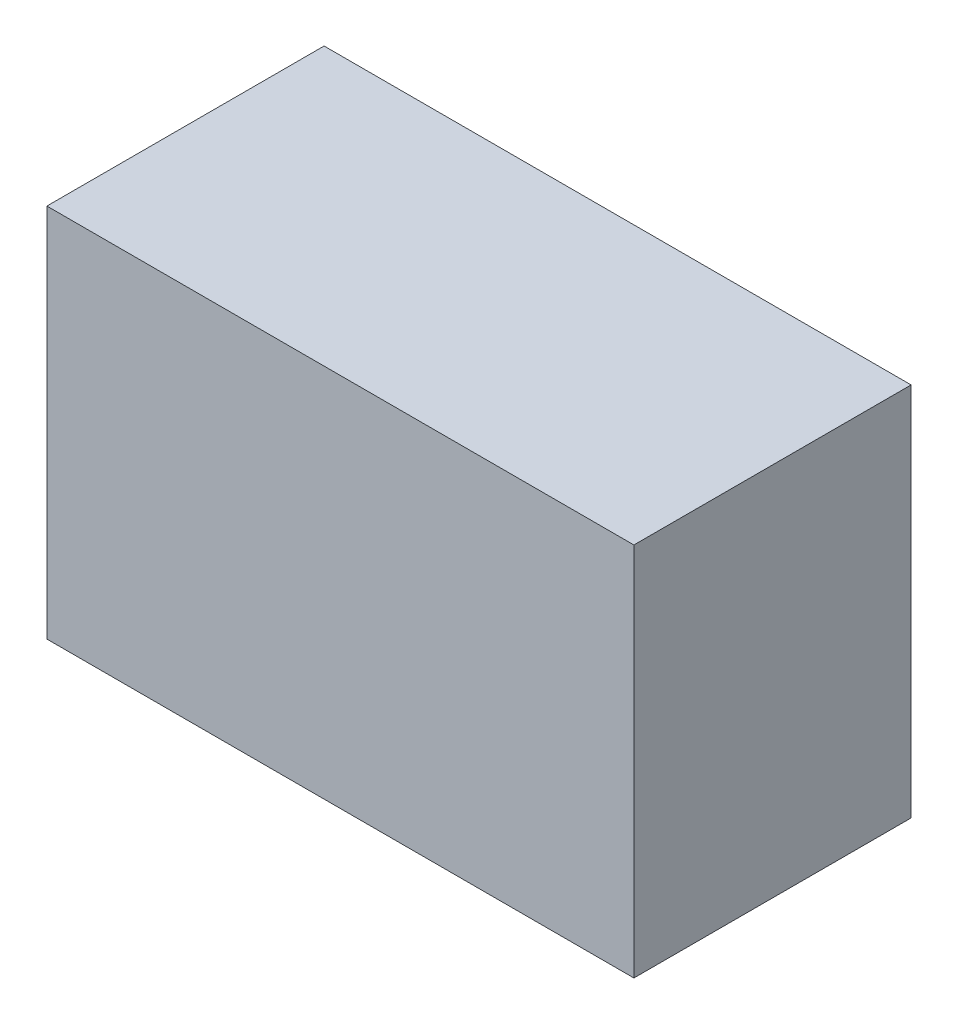
ISO-10303-21;
HEADER;
FILE_DESCRIPTION(('STEP AP214'),'2;1');
FILE_NAME('part.step','',(''),(''),'','','');
FILE_SCHEMA(('AUTOMOTIVE_DESIGN { 1 0 10303 214 1 1 1 1 }'));
ENDSEC;
DATA;
#1=APPLICATION_CONTEXT('core data for automotive mechanical design processes');
#2=APPLICATION_PROTOCOL_DEFINITION('international standard','automotive_design',2000,#1);
#3=PRODUCT_CONTEXT('',#1,'mechanical');
#4=PRODUCT('Part','Part','',(#3));
#5=PRODUCT_RELATED_PRODUCT_CATEGORY('part','',(#4));
#6=PRODUCT_DEFINITION_FORMATION('','',#4);
#7=PRODUCT_DEFINITION_CONTEXT('part definition',#1,'design');
#8=PRODUCT_DEFINITION('design','',#6,#7);
#9=PRODUCT_DEFINITION_SHAPE('','',#8);
#10=(LENGTH_UNIT() NAMED_UNIT(*) SI_UNIT(.MILLI.,.METRE.));
#11=(NAMED_UNIT(*) PLANE_ANGLE_UNIT() SI_UNIT($,.RADIAN.));
#12=(NAMED_UNIT(*) SI_UNIT($,.STERADIAN.) SOLID_ANGLE_UNIT());
#13=UNCERTAINTY_MEASURE_WITH_UNIT(LENGTH_MEASURE(1.E-05),#10,'distance_accuracy_value','');
#14=(GEOMETRIC_REPRESENTATION_CONTEXT(3) GLOBAL_UNCERTAINTY_ASSIGNED_CONTEXT((#13)) GLOBAL_UNIT_ASSIGNED_CONTEXT((#10,
#11,#12)) REPRESENTATION_CONTEXT('',''));
#15=CARTESIAN_POINT('',(0.,0.,0.));
#16=DIRECTION('',(0.,0.,1.));
#17=DIRECTION('',(1.,0.,0.));
#18=AXIS2_PLACEMENT_3D('',#15,#16,#17);
#19=CARTESIAN_POINT('',(36.,46.,17.));
#20=DIRECTION('',(-1.,0.,0.));
#21=DIRECTION('',(0.,0.,1.));
#22=AXIS2_PLACEMENT_3D('',#19,#20,#21);
#23=PLANE('',#22);
#24=DIRECTION('',(0.,0.,-1.));
#25=VECTOR('',#24,1.);
#26=CARTESIAN_POINT('',(36.,0.,17.));
#27=LINE('',#26,#25);
#28=CARTESIAN_POINT('',(36.,0.,17.));
#29=VERTEX_POINT('',#28);
#30=CARTESIAN_POINT('',(36.,0.,-17.));
#31=VERTEX_POINT('',#30);
#32=EDGE_CURVE('E102',#29,#31,#27,.T.);
#33=ORIENTED_EDGE('',*,*,#32,.T.);
#34=DIRECTION('',(0.,-1.,0.));
#35=VECTOR('',#34,1.);
#36=CARTESIAN_POINT('',(36.,46.,-17.));
#37=LINE('',#36,#35);
#38=CARTESIAN_POINT('',(36.,46.,-17.));
#39=VERTEX_POINT('',#38);
#40=EDGE_CURVE('E11',#39,#31,#37,.T.);
#41=ORIENTED_EDGE('',*,*,#40,.F.);
#42=DIRECTION('',(0.,0.,-1.));
#43=VECTOR('',#42,1.);
#44=CARTESIAN_POINT('',(36.,46.,17.));
#45=LINE('',#44,#43);
#46=CARTESIAN_POINT('',(36.,46.,17.));
#47=VERTEX_POINT('',#46);
#48=EDGE_CURVE('E95',#47,#39,#45,.T.);
#49=ORIENTED_EDGE('',*,*,#48,.F.);
#50=DIRECTION('',(0.,-1.,0.));
#51=VECTOR('',#50,1.);
#52=CARTESIAN_POINT('',(36.,46.,17.));
#53=LINE('',#52,#51);
#54=EDGE_CURVE('E99',#47,#29,#53,.T.);
#55=ORIENTED_EDGE('',*,*,#54,.T.);
#56=EDGE_LOOP('',(#33,#41,#49,#55));
#57=FACE_BOUND('',#56,.T.);
#58=ADVANCED_FACE('F41',(#57),#23,.F.);
#59=CARTESIAN_POINT('',(-36.,46.,-17.));
#60=DIRECTION('',(0.,0.,1.));
#61=DIRECTION('',(1.,0.,0.));
#62=AXIS2_PLACEMENT_3D('',#59,#60,#61);
#63=PLANE('',#62);
#64=DIRECTION('',(-1.,0.,0.));
#65=VECTOR('',#64,1.);
#66=CARTESIAN_POINT('',(-36.,0.,-17.));
#67=LINE('',#66,#65);
#68=CARTESIAN_POINT('',(-36.,0.,-17.));
#69=VERTEX_POINT('',#68);
#70=EDGE_CURVE('E96',#31,#69,#67,.T.);
#71=ORIENTED_EDGE('',*,*,#70,.T.);
#72=DIRECTION('',(0.,-1.,0.));
#73=VECTOR('',#72,1.);
#74=CARTESIAN_POINT('',(-36.,46.,-17.));
#75=LINE('',#74,#73);
#76=CARTESIAN_POINT('',(-36.,46.,-17.));
#77=VERTEX_POINT('',#76);
#78=EDGE_CURVE('E47',#77,#69,#75,.T.);
#79=ORIENTED_EDGE('',*,*,#78,.F.);
#80=DIRECTION('',(-1.,0.,0.));
#81=VECTOR('',#80,1.);
#82=CARTESIAN_POINT('',(-36.,46.,-17.));
#83=LINE('',#82,#81);
#84=EDGE_CURVE('E87',#39,#77,#83,.T.);
#85=ORIENTED_EDGE('',*,*,#84,.F.);
#86=ORIENTED_EDGE('',*,*,#40,.T.);
#87=EDGE_LOOP('',(#71,#79,#85,#86));
#88=FACE_BOUND('',#87,.T.);
#89=ADVANCED_FACE('F92',(#88),#63,.F.);
#90=CARTESIAN_POINT('',(-36.,46.,17.));
#91=DIRECTION('',(1.,0.,0.));
#92=DIRECTION('',(0.,0.,-1.));
#93=AXIS2_PLACEMENT_3D('',#90,#91,#92);
#94=PLANE('',#93);
#95=DIRECTION('',(0.,0.,1.));
#96=VECTOR('',#95,1.);
#97=CARTESIAN_POINT('',(-36.,0.,17.));
#98=LINE('',#97,#96);
#99=CARTESIAN_POINT('',(-36.,0.,17.));
#100=VERTEX_POINT('',#99);
#101=EDGE_CURVE('E74',#69,#100,#98,.T.);
#102=ORIENTED_EDGE('',*,*,#101,.T.);
#103=DIRECTION('',(0.,-1.,0.));
#104=VECTOR('',#103,1.);
#105=CARTESIAN_POINT('',(-36.,46.,17.));
#106=LINE('',#105,#104);
#107=CARTESIAN_POINT('',(-36.,46.,17.));
#108=VERTEX_POINT('',#107);
#109=EDGE_CURVE('E100',#108,#100,#106,.T.);
#110=ORIENTED_EDGE('',*,*,#109,.F.);
#111=DIRECTION('',(0.,0.,1.));
#112=VECTOR('',#111,1.);
#113=CARTESIAN_POINT('',(-36.,46.,17.));
#114=LINE('',#113,#112);
#115=EDGE_CURVE('E89',#77,#108,#114,.T.);
#116=ORIENTED_EDGE('',*,*,#115,.F.);
#117=ORIENTED_EDGE('',*,*,#78,.T.);
#118=EDGE_LOOP('',(#102,#110,#116,#117));
#119=FACE_BOUND('',#118,.T.);
#120=ADVANCED_FACE('F98',(#119),#94,.F.);
#121=CARTESIAN_POINT('',(-36.,46.,17.));
#122=DIRECTION('',(0.,0.,-1.));
#123=DIRECTION('',(-1.,0.,0.));
#124=AXIS2_PLACEMENT_3D('',#121,#122,#123);
#125=PLANE('',#124);
#126=DIRECTION('',(1.,0.,0.));
#127=VECTOR('',#126,1.);
#128=CARTESIAN_POINT('',(-36.,0.,17.));
#129=LINE('',#128,#127);
#130=EDGE_CURVE('E79',#100,#29,#129,.T.);
#131=ORIENTED_EDGE('',*,*,#130,.T.);
#132=ORIENTED_EDGE('',*,*,#54,.F.);
#133=DIRECTION('',(1.,0.,0.));
#134=VECTOR('',#133,1.);
#135=CARTESIAN_POINT('',(-36.,46.,17.));
#136=LINE('',#135,#134);
#137=EDGE_CURVE('E60',#108,#47,#136,.T.);
#138=ORIENTED_EDGE('',*,*,#137,.F.);
#139=ORIENTED_EDGE('',*,*,#109,.T.);
#140=EDGE_LOOP('',(#131,#132,#138,#139));
#141=FACE_BOUND('',#140,.T.);
#142=ADVANCED_FACE('F112',(#141),#125,.F.);
#143=CARTESIAN_POINT('',(0.,46.,0.));
#144=DIRECTION('',(0.,-1.,0.));
#145=DIRECTION('',(0.,0.,-1.));
#146=AXIS2_PLACEMENT_3D('',#143,#144,#145);
#147=PLANE('',#146);
#148=ORIENTED_EDGE('',*,*,#48,.T.);
#149=ORIENTED_EDGE('',*,*,#84,.T.);
#150=ORIENTED_EDGE('',*,*,#115,.T.);
#151=ORIENTED_EDGE('',*,*,#137,.T.);
#152=EDGE_LOOP('',(#148,#149,#150,#151));
#153=FACE_BOUND('',#152,.T.);
#154=ADVANCED_FACE('F86',(#153),#147,.F.);
#155=CARTESIAN_POINT('',(0.,0.,0.));
#156=DIRECTION('',(0.,-1.,0.));
#157=DIRECTION('',(0.,0.,-1.));
#158=AXIS2_PLACEMENT_3D('',#155,#156,#157);
#159=PLANE('',#158);
#160=ORIENTED_EDGE('',*,*,#32,.F.);
#161=ORIENTED_EDGE('',*,*,#130,.F.);
#162=ORIENTED_EDGE('',*,*,#101,.F.);
#163=ORIENTED_EDGE('',*,*,#70,.F.);
#164=EDGE_LOOP('',(#160,#161,#162,#163));
#165=FACE_BOUND('',#164,.T.);
#166=ADVANCED_FACE('F111',(#165),#159,.T.);
#167=CLOSED_SHELL('',(#58,#89,#120,#142,#154,#166));
#168=MANIFOLD_SOLID_BREP('B2',#167);
#169=ADVANCED_BREP_SHAPE_REPRESENTATION('',(#18,#168),#14);
#170=SHAPE_DEFINITION_REPRESENTATION(#9,#169);
ENDSEC;
END-ISO-10303-21;
